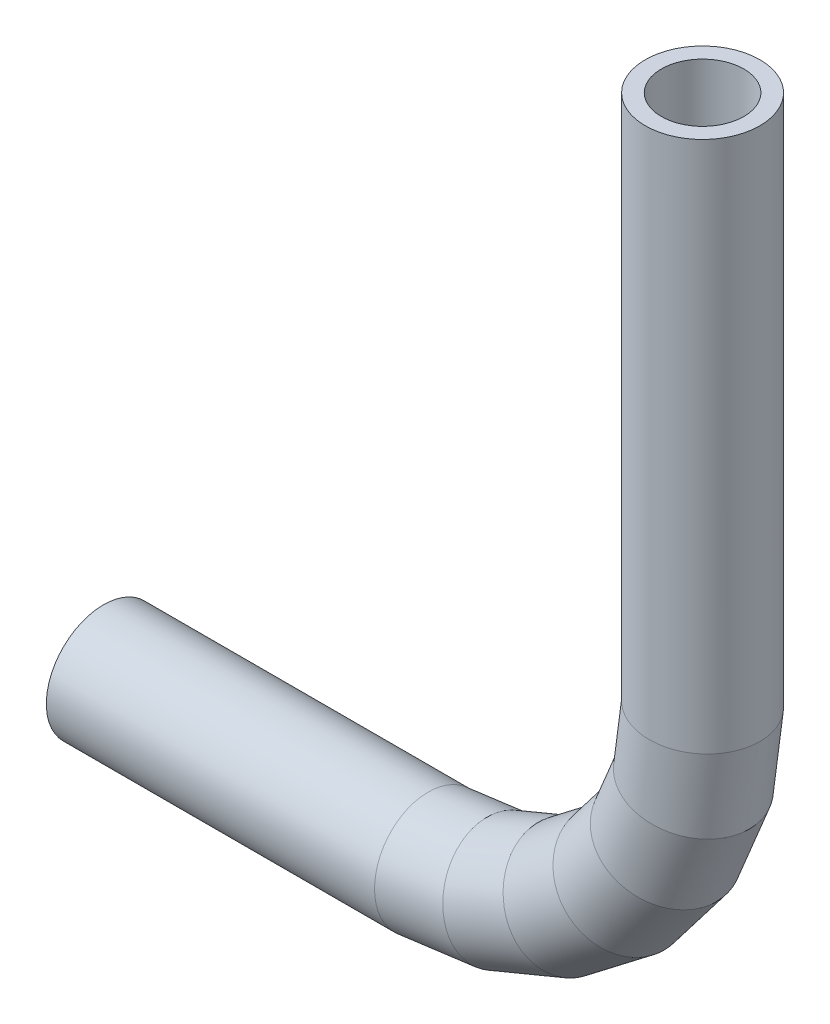
ISO-10303-21;
HEADER;
FILE_DESCRIPTION(('STEP AP214'),'2;1');
FILE_NAME('part.step','',(''),(''),'','','');
FILE_SCHEMA(('AUTOMOTIVE_DESIGN { 1 0 10303 214 1 1 1 1 }'));
ENDSEC;
DATA;
#1=APPLICATION_CONTEXT('core data for automotive mechanical design processes');
#2=APPLICATION_PROTOCOL_DEFINITION('international standard','automotive_design',2000,#1);
#3=PRODUCT_CONTEXT('',#1,'mechanical');
#4=PRODUCT('Part','Part','',(#3));
#5=PRODUCT_RELATED_PRODUCT_CATEGORY('part','',(#4));
#6=PRODUCT_DEFINITION_FORMATION('','',#4);
#7=PRODUCT_DEFINITION_CONTEXT('part definition',#1,'design');
#8=PRODUCT_DEFINITION('design','',#6,#7);
#9=PRODUCT_DEFINITION_SHAPE('','',#8);
#10=(LENGTH_UNIT() NAMED_UNIT(*) SI_UNIT(.MILLI.,.METRE.));
#11=(NAMED_UNIT(*) PLANE_ANGLE_UNIT() SI_UNIT($,.RADIAN.));
#12=(NAMED_UNIT(*) SI_UNIT($,.STERADIAN.) SOLID_ANGLE_UNIT());
#13=UNCERTAINTY_MEASURE_WITH_UNIT(LENGTH_MEASURE(1.E-05),#10,'distance_accuracy_value','');
#14=(GEOMETRIC_REPRESENTATION_CONTEXT(3) GLOBAL_UNCERTAINTY_ASSIGNED_CONTEXT((#13)) GLOBAL_UNIT_ASSIGNED_CONTEXT((#10,
#11,#12)) REPRESENTATION_CONTEXT('',''));
#15=CARTESIAN_POINT('',(0.,0.,0.));
#16=DIRECTION('',(0.,0.,1.));
#17=DIRECTION('',(1.,0.,0.));
#18=AXIS2_PLACEMENT_3D('',#15,#16,#17);
#19=CARTESIAN_POINT('',(-487.5,50.4421789122355,0.));
#20=DIRECTION('',(0.,1.,0.));
#21=DIRECTION('',(0.,0.,1.));
#22=AXIS2_PLACEMENT_3D('',#19,#20,#21);
#23=CYLINDRICAL_SURFACE('',#22,3.175);
#24=CARTESIAN_POINT('',(-487.5,51.,0.));
#25=DIRECTION('',(0.065403129230146,0.997858923238603,0.));
#26=DIRECTION('',(0.997858923238603,-0.065403129230146,0.));
#27=AXIS2_PLACEMENT_3D('',#24,#25,#26);
#28=ELLIPSE('',#27,3.18181250481318,3.175);
#29=CARTESIAN_POINT('',(-484.325,50.7918995055616,0.));
#30=VERTEX_POINT('',#29);
#31=EDGE_CURVE('E45',#30,#30,#28,.F.);
#32=ORIENTED_EDGE('',*,*,#31,.F.);
#33=EDGE_LOOP('',(#32));
#34=FACE_BOUND('',#33,.T.);
#35=CARTESIAN_POINT('',(-487.5,80.3500000000003,0.));
#36=DIRECTION('',(0.,1.,0.));
#37=DIRECTION('',(0.,0.,-1.));
#38=AXIS2_PLACEMENT_3D('',#35,#36,#37);
#39=CIRCLE('',#38,3.175);
#40=CARTESIAN_POINT('',(-487.5,80.3500000000003,-3.175));
#41=VERTEX_POINT('',#40);
#42=EDGE_CURVE('E80',#41,#41,#39,.T.);
#43=ORIENTED_EDGE('',*,*,#42,.F.);
#44=EDGE_LOOP('',(#43));
#45=FACE_BOUND('',#44,.T.);
#46=ADVANCED_FACE('F39',(#34,#45),#23,.T.);
#47=CARTESIAN_POINT('',(-488.144196157842,46.1068443846676,0.));
#48=DIRECTION('',(0.130526192220057,0.991444861373809,0.));
#49=DIRECTION('',(-0.99144486137381,0.130526192220058,0.));
#50=AXIS2_PLACEMENT_3D('',#47,#48,#49);
#51=CYLINDRICAL_SURFACE('',#50,3.175);
#52=CARTESIAN_POINT('',(-488.011112605664,47.1177143234621,0.));
#53=DIRECTION('',(0.258819045102522,0.965925826289068,0.));
#54=DIRECTION('',(0.965925826289068,-0.258819045102522,0.));
#55=AXIS2_PLACEMENT_3D('',#52,#53,#54);
#56=ELLIPSE('',#55,3.20239694984198,3.175);
#57=CARTESIAN_POINT('',(-484.917834685782,46.2888730028648,0.));
#58=VERTEX_POINT('',#57);
#59=EDGE_CURVE('E94',#58,#58,#56,.F.);
#60=ORIENTED_EDGE('',*,*,#59,.F.);
#61=EDGE_LOOP('',(#60));
#62=FACE_BOUND('',#61,.T.);
#63=ORIENTED_EDGE('',*,*,#31,.T.);
#64=EDGE_LOOP('',(#63));
#65=FACE_BOUND('',#64,.T.);
#66=ADVANCED_FACE('F101',(#62,#65),#51,.T.);
#67=CARTESIAN_POINT('',(-489.899800175618,42.5580191769926,0.));
#68=DIRECTION('',(0.382683432365086,0.923879532511288,0.));
#69=DIRECTION('',(-0.923879532511288,0.382683432365086,0.));
#70=AXIS2_PLACEMENT_3D('',#67,#68,#69);
#71=CYLINDRICAL_SURFACE('',#70,3.175);
#72=CARTESIAN_POINT('',(-489.509618943233,43.4999999999999,0.));
#73=DIRECTION('',(0.5,0.866025403784439,0.));
#74=DIRECTION('',(0.866025403784439,-0.5,0.));
#75=AXIS2_PLACEMENT_3D('',#72,#73,#74);
#76=ELLIPSE('',#75,3.20239694984199,3.175);
#77=CARTESIAN_POINT('',(-486.736261831668,41.8988015250789,0.));
#78=VERTEX_POINT('',#77);
#79=EDGE_CURVE('E95',#78,#78,#76,.F.);
#80=ORIENTED_EDGE('',*,*,#79,.F.);
#81=EDGE_LOOP('',(#80));
#82=FACE_BOUND('',#81,.T.);
#83=ORIENTED_EDGE('',*,*,#59,.T.);
#84=EDGE_LOOP('',(#83));
#85=FACE_BOUND('',#84,.T.);
#86=ADVANCED_FACE('F251',(#82,#85),#71,.T.);
#87=CARTESIAN_POINT('',(-492.514086988611,39.5845010113728,0.));
#88=DIRECTION('',(0.608761429008724,0.793353340291233,0.));
#89=DIRECTION('',(-0.793353340291233,0.608761429008724,0.));
#90=AXIS2_PLACEMENT_3D('',#87,#88,#89);
#91=CYLINDRICAL_SURFACE('',#90,3.175);
#92=CARTESIAN_POINT('',(-491.893398282202,40.3933982822017,0.));
#93=DIRECTION('',(0.707106781186548,0.707106781186547,0.));
#94=DIRECTION('',(0.707106781186547,-0.707106781186548,0.));
#95=AXIS2_PLACEMENT_3D('',#92,#93,#94);
#96=ELLIPSE('',#95,3.20239694984198,3.175);
#97=CARTESIAN_POINT('',(-489.628961682917,38.1289616829173,0.));
#98=VERTEX_POINT('',#97);
#99=EDGE_CURVE('E90',#98,#98,#96,.F.);
#100=ORIENTED_EDGE('',*,*,#99,.F.);
#101=EDGE_LOOP('',(#100));
#102=FACE_BOUND('',#101,.T.);
#103=ORIENTED_EDGE('',*,*,#79,.T.);
#104=EDGE_LOOP('',(#103));
#105=FACE_BOUND('',#104,.T.);
#106=ADVANCED_FACE('F241',(#102,#105),#91,.T.);
#107=CARTESIAN_POINT('',(-495.808897270829,37.3889302368238,0.));
#108=DIRECTION('',(0.793353340291233,0.608761429008723,0.));
#109=DIRECTION('',(-0.608761429008723,0.793353340291233,0.));
#110=AXIS2_PLACEMENT_3D('',#107,#108,#109);
#111=CYLINDRICAL_SURFACE('',#110,3.175);
#112=CARTESIAN_POINT('',(-495.,38.0096189432334,0.));
#113=DIRECTION('',(0.866025403784438,0.500000000000001,0.));
#114=DIRECTION('',(0.500000000000001,-0.866025403784438,0.));
#115=AXIS2_PLACEMENT_3D('',#112,#113,#114);
#116=ELLIPSE('',#115,3.20239694984199,3.175);
#117=CARTESIAN_POINT('',(-493.398801525079,35.2362618316684,0.));
#118=VERTEX_POINT('',#117);
#119=EDGE_CURVE('E88',#118,#118,#116,.F.);
#120=ORIENTED_EDGE('',*,*,#119,.F.);
#121=EDGE_LOOP('',(#120));
#122=FACE_BOUND('',#121,.T.);
#123=ORIENTED_EDGE('',*,*,#99,.T.);
#124=EDGE_LOOP('',(#123));
#125=FACE_BOUND('',#124,.T.);
#126=ADVANCED_FACE('F234',(#122,#125),#111,.T.);
#127=CARTESIAN_POINT('',(-499.559695146469,36.120931373279,0.));
#128=DIRECTION('',(0.923879532511287,0.382683432365089,0.));
#129=DIRECTION('',(-0.382683432365089,0.923879532511287,0.));
#130=AXIS2_PLACEMENT_3D('',#127,#128,#129);
#131=CYLINDRICAL_SURFACE('',#130,3.175);
#132=CARTESIAN_POINT('',(-498.617714323462,36.511112605664,0.));
#133=DIRECTION('',(0.965925826289068,0.258819045102521,0.));
#134=DIRECTION('',(0.258819045102521,-0.965925826289068,0.));
#135=AXIS2_PLACEMENT_3D('',#132,#133,#134);
#136=ELLIPSE('',#135,3.20239694984198,3.175);
#137=CARTESIAN_POINT('',(-497.788873002865,33.4178346857822,0.));
#138=VERTEX_POINT('',#137);
#139=EDGE_CURVE('E82',#138,#138,#136,.F.);
#140=ORIENTED_EDGE('',*,*,#139,.F.);
#141=EDGE_LOOP('',(#140));
#142=FACE_BOUND('',#141,.T.);
#143=ORIENTED_EDGE('',*,*,#119,.T.);
#144=EDGE_LOOP('',(#143));
#145=FACE_BOUND('',#144,.T.);
#146=ADVANCED_FACE('F227',(#142,#145),#131,.T.);
#147=CARTESIAN_POINT('',(-503.05304885103,35.927189737474,0.));
#148=DIRECTION('',(0.99144486137381,0.130526192220054,0.));
#149=DIRECTION('',(-0.130526192220054,0.99144486137381,0.));
#150=AXIS2_PLACEMENT_3D('',#147,#148,#149);
#151=CYLINDRICAL_SURFACE('',#150,3.175);
#152=CARTESIAN_POINT('',(-502.5,36.,0.));
#153=DIRECTION('',(0.997858923238603,0.0654031292301443,0.));
#154=DIRECTION('',(0.0654031292301443,-0.997858923238604,0.));
#155=AXIS2_PLACEMENT_3D('',#152,#153,#154);
#156=ELLIPSE('',#155,3.18181250481318,3.175);
#157=CARTESIAN_POINT('',(-502.291899505562,32.825,0.));
#158=VERTEX_POINT('',#157);
#159=EDGE_CURVE('E78',#158,#158,#156,.F.);
#160=ORIENTED_EDGE('',*,*,#159,.F.);
#161=EDGE_LOOP('',(#160));
#162=FACE_BOUND('',#161,.T.);
#163=ORIENTED_EDGE('',*,*,#139,.T.);
#164=EDGE_LOOP('',(#163));
#165=FACE_BOUND('',#164,.T.);
#166=ADVANCED_FACE('F118',(#162,#165),#151,.T.);
#167=CARTESIAN_POINT('',(-520.7,36.,0.));
#168=DIRECTION('',(1.,0.,0.));
#169=DIRECTION('',(0.,0.,-1.));
#170=AXIS2_PLACEMENT_3D('',#167,#168,#169);
#171=CYLINDRICAL_SURFACE('',#170,3.175);
#172=CARTESIAN_POINT('',(-520.7,36.,0.));
#173=DIRECTION('',(1.,0.,0.));
#174=DIRECTION('',(0.,0.,-1.));
#175=AXIS2_PLACEMENT_3D('',#172,#173,#174);
#176=CIRCLE('',#175,3.175);
#177=CARTESIAN_POINT('',(-520.7,36.,-3.175));
#178=VERTEX_POINT('',#177);
#179=EDGE_CURVE('E74',#178,#178,#176,.T.);
#180=ORIENTED_EDGE('',*,*,#179,.T.);
#181=EDGE_LOOP('',(#180));
#182=FACE_BOUND('',#181,.T.);
#183=ORIENTED_EDGE('',*,*,#159,.T.);
#184=EDGE_LOOP('',(#183));
#185=FACE_BOUND('',#184,.T.);
#186=ADVANCED_FACE('F109',(#182,#185),#171,.T.);
#187=CARTESIAN_POINT('',(-487.5,80.3500000000003,0.));
#188=DIRECTION('',(0.,1.,0.));
#189=DIRECTION('',(0.,0.,-1.));
#190=AXIS2_PLACEMENT_3D('',#187,#188,#189);
#191=PLANE('',#190);
#192=CARTESIAN_POINT('',(-487.5,80.3500000000003,0.));
#193=DIRECTION('',(0.,1.,0.));
#194=DIRECTION('',(0.,0.,-1.));
#195=AXIS2_PLACEMENT_3D('',#192,#193,#194);
#196=CIRCLE('',#195,2.286);
#197=CARTESIAN_POINT('',(-487.5,80.3500000000003,-2.286));
#198=VERTEX_POINT('',#197);
#199=EDGE_CURVE('E72',#198,#198,#196,.F.);
#200=ORIENTED_EDGE('',*,*,#199,.T.);
#201=EDGE_LOOP('',(#200));
#202=FACE_BOUND('',#201,.T.);
#203=ORIENTED_EDGE('',*,*,#42,.T.);
#204=EDGE_LOOP('',(#203));
#205=FACE_BOUND('',#204,.T.);
#206=ADVANCED_FACE('F110',(#202,#205),#191,.T.);
#207=CARTESIAN_POINT('',(-520.7,36.,0.));
#208=DIRECTION('',(1.,0.,0.));
#209=DIRECTION('',(0.,0.,-1.));
#210=AXIS2_PLACEMENT_3D('',#207,#208,#209);
#211=PLANE('',#210);
#212=CARTESIAN_POINT('',(-520.7,36.,0.));
#213=DIRECTION('',(1.,0.,0.));
#214=DIRECTION('',(0.,0.,-1.));
#215=AXIS2_PLACEMENT_3D('',#212,#213,#214);
#216=CIRCLE('',#215,2.286);
#217=CARTESIAN_POINT('',(-520.7,36.,-2.286));
#218=VERTEX_POINT('',#217);
#219=EDGE_CURVE('E46',#218,#218,#216,.F.);
#220=ORIENTED_EDGE('',*,*,#219,.F.);
#221=EDGE_LOOP('',(#220));
#222=FACE_BOUND('',#221,.T.);
#223=ORIENTED_EDGE('',*,*,#179,.F.);
#224=EDGE_LOOP('',(#223));
#225=FACE_BOUND('',#224,.T.);
#226=ADVANCED_FACE('F108',(#222,#225),#211,.F.);
#227=CARTESIAN_POINT('',(-487.5,50.5703688168095,0.));
#228=DIRECTION('',(0.,1.,0.));
#229=DIRECTION('',(0.,0.,1.));
#230=AXIS2_PLACEMENT_3D('',#227,#228,#229);
#231=CYLINDRICAL_SURFACE('',#230,2.286);
#232=CARTESIAN_POINT('',(-487.5,51.,0.));
#233=DIRECTION('',(0.065403129230146,0.997858923238603,0.));
#234=DIRECTION('',(0.997858923238603,-0.065403129230146,0.));
#235=AXIS2_PLACEMENT_3D('',#232,#233,#234);
#236=ELLIPSE('',#235,2.29090500346549,2.286);
#237=CARTESIAN_POINT('',(-485.214,50.8501676440043,0.));
#238=VERTEX_POINT('',#237);
#239=EDGE_CURVE('E67',#238,#238,#236,.T.);
#240=ORIENTED_EDGE('',*,*,#239,.F.);
#241=EDGE_LOOP('',(#240));
#242=FACE_BOUND('',#241,.T.);
#243=ORIENTED_EDGE('',*,*,#199,.F.);
#244=EDGE_LOOP('',(#243));
#245=FACE_BOUND('',#244,.T.);
#246=ADVANCED_FACE('F120',(#242,#245),#231,.F.);
#247=CARTESIAN_POINT('',(-488.110587496614,46.3621275114114,0.));
#248=DIRECTION('',(0.130526192220058,0.99144486137381,0.));
#249=DIRECTION('',(-0.99144486137381,0.130526192220058,0.));
#250=AXIS2_PLACEMENT_3D('',#247,#248,#249);
#251=CYLINDRICAL_SURFACE('',#250,2.286);
#252=CARTESIAN_POINT('',(-488.011112605664,47.1177143234621,0.));
#253=DIRECTION('',(0.258819045102522,0.965925826289068,0.));
#254=DIRECTION('',(0.965925826289068,-0.258819045102522,0.));
#255=AXIS2_PLACEMENT_3D('',#252,#253,#254);
#256=ELLIPSE('',#255,2.30572580388623,2.286);
#257=CARTESIAN_POINT('',(-485.783952503349,46.5209485726321,0.));
#258=VERTEX_POINT('',#257);
#259=EDGE_CURVE('E63',#258,#258,#256,.T.);
#260=ORIENTED_EDGE('',*,*,#259,.F.);
#261=EDGE_LOOP('',(#260));
#262=FACE_BOUND('',#261,.T.);
#263=ORIENTED_EDGE('',*,*,#239,.T.);
#264=EDGE_LOOP('',(#263));
#265=FACE_BOUND('',#264,.T.);
#266=ADVANCED_FACE('F149',(#262,#265),#251,.F.);
#267=CARTESIAN_POINT('',(-489.801264566657,42.7959051805243,0.));
#268=DIRECTION('',(0.382683432365086,0.923879532511288,0.));
#269=DIRECTION('',(-0.923879532511288,0.382683432365086,0.));
#270=AXIS2_PLACEMENT_3D('',#267,#268,#269);
#271=CYLINDRICAL_SURFACE('',#270,2.286);
#272=CARTESIAN_POINT('',(-489.509618943233,43.4999999999999,0.));
#273=DIRECTION('',(0.5,0.866025403784439,0.));
#274=DIRECTION('',(0.866025403784439,-0.5,0.));
#275=AXIS2_PLACEMENT_3D('',#272,#273,#274);
#276=ELLIPSE('',#275,2.30572580388623,2.286);
#277=CARTESIAN_POINT('',(-487.512801822906,42.3471370980568,0.));
#278=VERTEX_POINT('',#277);
#279=EDGE_CURVE('E65',#278,#278,#276,.T.);
#280=ORIENTED_EDGE('',*,*,#279,.F.);
#281=EDGE_LOOP('',(#280));
#282=FACE_BOUND('',#281,.T.);
#283=ORIENTED_EDGE('',*,*,#259,.T.);
#284=EDGE_LOOP('',(#283));
#285=FACE_BOUND('',#284,.T.);
#286=ADVANCED_FACE('F144',(#282,#285),#271,.F.);
#287=CARTESIAN_POINT('',(-492.357339470829,39.7887783536767,0.));
#288=DIRECTION('',(0.608761429008724,0.793353340291233,0.));
#289=DIRECTION('',(-0.793353340291233,0.608761429008724,0.));
#290=AXIS2_PLACEMENT_3D('',#287,#288,#289);
#291=CYLINDRICAL_SURFACE('',#290,2.286);
#292=CARTESIAN_POINT('',(-491.893398282202,40.3933982822017,0.));
#293=DIRECTION('',(0.707106781186548,0.707106781186547,0.));
#294=DIRECTION('',(0.707106781186547,-0.707106781186548,0.));
#295=AXIS2_PLACEMENT_3D('',#292,#293,#294);
#296=ELLIPSE('',#295,2.30572580388623,2.286);
#297=CARTESIAN_POINT('',(-490.263003930717,38.7630039307169,0.));
#298=VERTEX_POINT('',#297);
#299=EDGE_CURVE('E56',#298,#298,#296,.T.);
#300=ORIENTED_EDGE('',*,*,#299,.F.);
#301=EDGE_LOOP('',(#300));
#302=FACE_BOUND('',#301,.T.);
#303=ORIENTED_EDGE('',*,*,#279,.T.);
#304=EDGE_LOOP('',(#303));
#305=FACE_BOUND('',#304,.T.);
#306=ADVANCED_FACE('F143',(#302,#305),#291,.F.);
#307=CARTESIAN_POINT('',(-495.604619928525,37.5456777546062,0.));
#308=DIRECTION('',(0.793353340291233,0.608761429008723,0.));
#309=DIRECTION('',(-0.608761429008723,0.793353340291233,0.));
#310=AXIS2_PLACEMENT_3D('',#307,#308,#309);
#311=CYLINDRICAL_SURFACE('',#310,2.286);
#312=CARTESIAN_POINT('',(-495.,38.0096189432334,0.));
#313=DIRECTION('',(0.866025403784438,0.500000000000001,0.));
#314=DIRECTION('',(0.500000000000001,-0.866025403784438,0.));
#315=AXIS2_PLACEMENT_3D('',#312,#313,#314);
#316=ELLIPSE('',#315,2.30572580388623,2.286);
#317=CARTESIAN_POINT('',(-493.847137098057,36.0128018229066,0.));
#318=VERTEX_POINT('',#317);
#319=EDGE_CURVE('E57',#318,#318,#316,.T.);
#320=ORIENTED_EDGE('',*,*,#319,.F.);
#321=EDGE_LOOP('',(#320));
#322=FACE_BOUND('',#321,.T.);
#323=ORIENTED_EDGE('',*,*,#299,.T.);
#324=EDGE_LOOP('',(#323));
#325=FACE_BOUND('',#324,.T.);
#326=ADVANCED_FACE('F140',(#322,#325),#311,.F.);
#327=CARTESIAN_POINT('',(-499.321809142938,36.2194669822405,0.));
#328=DIRECTION('',(0.923879532511287,0.382683432365088,0.));
#329=DIRECTION('',(-0.382683432365089,0.923879532511287,0.));
#330=AXIS2_PLACEMENT_3D('',#327,#328,#329);
#331=CYLINDRICAL_SURFACE('',#330,2.286);
#332=CARTESIAN_POINT('',(-498.617714323462,36.5111126056639,0.));
#333=DIRECTION('',(0.965925826289068,0.258819045102521,0.));
#334=DIRECTION('',(0.258819045102521,-0.965925826289068,0.));
#335=AXIS2_PLACEMENT_3D('',#332,#333,#334);
#336=ELLIPSE('',#335,2.30572580388623,2.286);
#337=CARTESIAN_POINT('',(-498.020948572632,34.2839525033491,0.));
#338=VERTEX_POINT('',#337);
#339=EDGE_CURVE('E51',#338,#338,#336,.T.);
#340=ORIENTED_EDGE('',*,*,#339,.F.);
#341=EDGE_LOOP('',(#340));
#342=FACE_BOUND('',#341,.T.);
#343=ORIENTED_EDGE('',*,*,#319,.T.);
#344=EDGE_LOOP('',(#343));
#345=FACE_BOUND('',#344,.T.);
#346=ADVANCED_FACE('F132',(#342,#345),#331,.F.);
#347=CARTESIAN_POINT('',(-502.92595562886,35.9439218775991,0.));
#348=DIRECTION('',(0.99144486137381,0.130526192220054,0.));
#349=DIRECTION('',(-0.130526192220054,0.99144486137381,0.));
#350=AXIS2_PLACEMENT_3D('',#347,#348,#349);
#351=CYLINDRICAL_SURFACE('',#350,2.286);
#352=CARTESIAN_POINT('',(-502.5,36.,0.));
#353=DIRECTION('',(0.997858923238603,0.0654031292301443,0.));
#354=DIRECTION('',(0.0654031292301443,-0.997858923238604,0.));
#355=AXIS2_PLACEMENT_3D('',#352,#353,#354);
#356=ELLIPSE('',#355,2.29090500346549,2.286);
#357=CARTESIAN_POINT('',(-502.350167644004,33.714,0.));
#358=VERTEX_POINT('',#357);
#359=EDGE_CURVE('E10',#358,#358,#356,.T.);
#360=ORIENTED_EDGE('',*,*,#359,.F.);
#361=EDGE_LOOP('',(#360));
#362=FACE_BOUND('',#361,.T.);
#363=ORIENTED_EDGE('',*,*,#339,.T.);
#364=EDGE_LOOP('',(#363));
#365=FACE_BOUND('',#364,.T.);
#366=ADVANCED_FACE('F124',(#362,#365),#351,.F.);
#367=CARTESIAN_POINT('',(-520.7,36.,0.));
#368=DIRECTION('',(1.,0.,0.));
#369=DIRECTION('',(0.,0.,-1.));
#370=AXIS2_PLACEMENT_3D('',#367,#368,#369);
#371=CYLINDRICAL_SURFACE('',#370,2.286);
#372=ORIENTED_EDGE('',*,*,#219,.T.);
#373=EDGE_LOOP('',(#372));
#374=FACE_BOUND('',#373,.T.);
#375=ORIENTED_EDGE('',*,*,#359,.T.);
#376=EDGE_LOOP('',(#375));
#377=FACE_BOUND('',#376,.T.);
#378=ADVANCED_FACE('F122',(#374,#377),#371,.F.);
#379=CLOSED_SHELL('',(#46,#66,#86,#106,#126,#146,#166,#186,#206,#226,#246,#266,#286,#306,#326,
#346,#366,#378));
#380=MANIFOLD_SOLID_BREP('B2',#379);
#381=ADVANCED_BREP_SHAPE_REPRESENTATION('',(#18,#380),#14);
#382=SHAPE_DEFINITION_REPRESENTATION(#9,#381);
ENDSEC;
END-ISO-10303-21;
